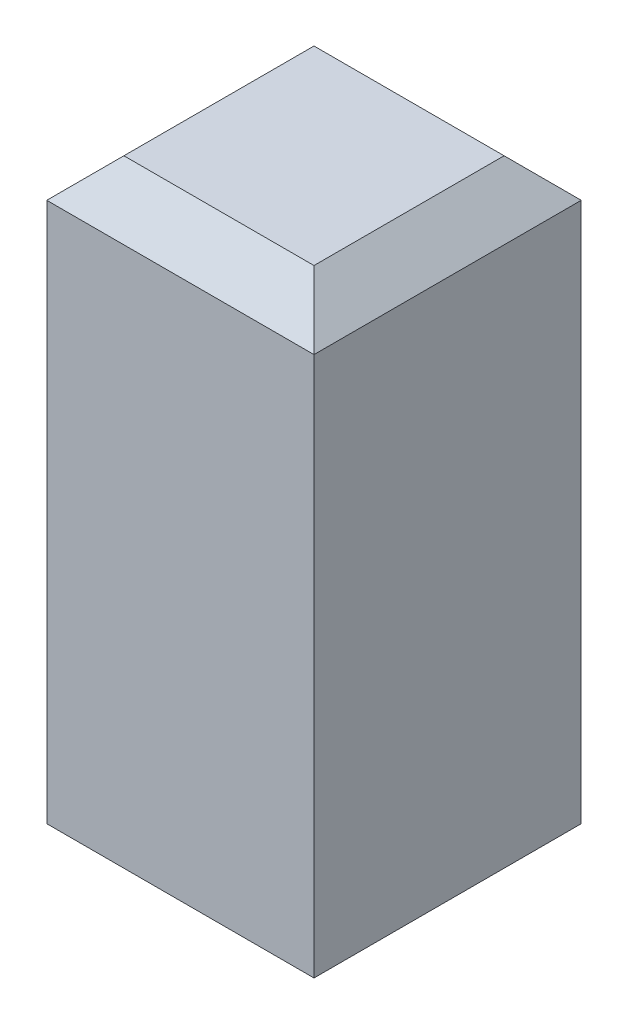
ISO-10303-21;
HEADER;
FILE_DESCRIPTION(('STEP AP214'),'2;1');
FILE_NAME('part.step','',(''),(''),'','','');
FILE_SCHEMA(('AUTOMOTIVE_DESIGN { 1 0 10303 214 1 1 1 1 }'));
ENDSEC;
DATA;
#1=APPLICATION_CONTEXT('core data for automotive mechanical design processes');
#2=APPLICATION_PROTOCOL_DEFINITION('international standard','automotive_design',2000,#1);
#3=PRODUCT_CONTEXT('',#1,'mechanical');
#4=PRODUCT('Part','Part','',(#3));
#5=PRODUCT_RELATED_PRODUCT_CATEGORY('part','',(#4));
#6=PRODUCT_DEFINITION_FORMATION('','',#4);
#7=PRODUCT_DEFINITION_CONTEXT('part definition',#1,'design');
#8=PRODUCT_DEFINITION('design','',#6,#7);
#9=PRODUCT_DEFINITION_SHAPE('','',#8);
#10=(LENGTH_UNIT() NAMED_UNIT(*) SI_UNIT(.MILLI.,.METRE.));
#11=(NAMED_UNIT(*) PLANE_ANGLE_UNIT() SI_UNIT($,.RADIAN.));
#12=(NAMED_UNIT(*) SI_UNIT($,.STERADIAN.) SOLID_ANGLE_UNIT());
#13=UNCERTAINTY_MEASURE_WITH_UNIT(LENGTH_MEASURE(1.E-05),#10,'distance_accuracy_value','');
#14=(GEOMETRIC_REPRESENTATION_CONTEXT(3) GLOBAL_UNCERTAINTY_ASSIGNED_CONTEXT((#13)) GLOBAL_UNIT_ASSIGNED_CONTEXT((#10,
#11,#12)) REPRESENTATION_CONTEXT('',''));
#15=CARTESIAN_POINT('',(0.,0.,0.));
#16=DIRECTION('',(0.,0.,1.));
#17=DIRECTION('',(1.,0.,0.));
#18=AXIS2_PLACEMENT_3D('',#15,#16,#17);
#19=CARTESIAN_POINT('',(0.,10.16,0.));
#20=DIRECTION('',(1.,0.,0.));
#21=DIRECTION('',(0.,0.,-1.));
#22=AXIS2_PLACEMENT_3D('',#19,#20,#21);
#23=PLANE('',#22);
#24=DIRECTION('',(0.,-1.,0.));
#25=VECTOR('',#24,1.);
#26=CARTESIAN_POINT('',(0.,10.16,-4.40032549932388));
#27=LINE('',#26,#25);
#28=CARTESIAN_POINT('',(0.,9.525,-4.40032549932388));
#29=VERTEX_POINT('',#28);
#30=CARTESIAN_POINT('',(0.,0.635,-4.40032549932388));
#31=VERTEX_POINT('',#30);
#32=EDGE_CURVE('E151',#29,#31,#27,.T.);
#33=ORIENTED_EDGE('',*,*,#32,.T.);
#34=DIRECTION('',(0.,0.,1.));
#35=VECTOR('',#34,1.);
#36=CARTESIAN_POINT('',(0.,0.635,0.));
#37=LINE('',#36,#35);
#38=CARTESIAN_POINT('',(0.,0.635,0.));
#39=VERTEX_POINT('',#38);
#40=EDGE_CURVE('E160',#31,#39,#37,.T.);
#41=ORIENTED_EDGE('',*,*,#40,.T.);
#42=DIRECTION('',(0.,-1.,0.));
#43=VECTOR('',#42,1.);
#44=CARTESIAN_POINT('',(0.,10.16,0.));
#45=LINE('',#44,#43);
#46=CARTESIAN_POINT('',(0.,9.525,0.));
#47=VERTEX_POINT('',#46);
#48=EDGE_CURVE('E129',#47,#39,#45,.T.);
#49=ORIENTED_EDGE('',*,*,#48,.F.);
#50=DIRECTION('',(0.,0.,-1.));
#51=VECTOR('',#50,1.);
#52=CARTESIAN_POINT('',(0.,9.525,0.));
#53=LINE('',#52,#51);
#54=EDGE_CURVE('E162',#47,#29,#53,.T.);
#55=ORIENTED_EDGE('',*,*,#54,.T.);
#56=EDGE_LOOP('',(#33,#41,#49,#55));
#57=FACE_BOUND('',#56,.T.);
#58=ADVANCED_FACE('F41',(#57),#23,.F.);
#59=CARTESIAN_POINT('',(0.,10.16,0.));
#60=DIRECTION('',(0.,0.,-1.));
#61=DIRECTION('',(-1.,0.,0.));
#62=AXIS2_PLACEMENT_3D('',#59,#60,#61);
#63=PLANE('',#62);
#64=ORIENTED_EDGE('',*,*,#48,.T.);
#65=DIRECTION('',(1.,0.,0.));
#66=VECTOR('',#65,1.);
#67=CARTESIAN_POINT('',(4.40032549932388,0.635,0.));
#68=LINE('',#67,#66);
#69=CARTESIAN_POINT('',(4.40032549932388,0.635,0.));
#70=VERTEX_POINT('',#69);
#71=EDGE_CURVE('E128',#39,#70,#68,.T.);
#72=ORIENTED_EDGE('',*,*,#71,.T.);
#73=DIRECTION('',(0.,-1.,0.));
#74=VECTOR('',#73,1.);
#75=CARTESIAN_POINT('',(4.40032549932388,10.16,0.));
#76=LINE('',#75,#74);
#77=CARTESIAN_POINT('',(4.40032549932388,9.525,0.));
#78=VERTEX_POINT('',#77);
#79=EDGE_CURVE('E111',#78,#70,#76,.T.);
#80=ORIENTED_EDGE('',*,*,#79,.F.);
#81=DIRECTION('',(-1.,0.,0.));
#82=VECTOR('',#81,1.);
#83=CARTESIAN_POINT('',(0.,9.525,0.));
#84=LINE('',#83,#82);
#85=EDGE_CURVE('E125',#78,#47,#84,.T.);
#86=ORIENTED_EDGE('',*,*,#85,.T.);
#87=EDGE_LOOP('',(#64,#72,#80,#86));
#88=FACE_BOUND('',#87,.T.);
#89=ADVANCED_FACE('F124',(#88),#63,.F.);
#90=CARTESIAN_POINT('',(4.40032549932388,10.16,0.));
#91=DIRECTION('',(-1.,0.,0.));
#92=DIRECTION('',(0.,0.,1.));
#93=AXIS2_PLACEMENT_3D('',#90,#91,#92);
#94=PLANE('',#93);
#95=ORIENTED_EDGE('',*,*,#79,.T.);
#96=DIRECTION('',(0.,0.,-1.));
#97=VECTOR('',#96,1.);
#98=CARTESIAN_POINT('',(4.40032549932388,0.635,-4.40032549932388));
#99=LINE('',#98,#97);
#100=CARTESIAN_POINT('',(4.40032549932388,0.635,-4.40032549932388));
#101=VERTEX_POINT('',#100);
#102=EDGE_CURVE('E117',#70,#101,#99,.T.);
#103=ORIENTED_EDGE('',*,*,#102,.T.);
#104=DIRECTION('',(0.,-1.,0.));
#105=VECTOR('',#104,1.);
#106=CARTESIAN_POINT('',(4.40032549932388,10.16,-4.40032549932388));
#107=LINE('',#106,#105);
#108=CARTESIAN_POINT('',(4.40032549932388,9.525,-4.40032549932388));
#109=VERTEX_POINT('',#108);
#110=EDGE_CURVE('E113',#109,#101,#107,.T.);
#111=ORIENTED_EDGE('',*,*,#110,.F.);
#112=DIRECTION('',(0.,0.,1.));
#113=VECTOR('',#112,1.);
#114=CARTESIAN_POINT('',(4.40032549932388,9.525,0.));
#115=LINE('',#114,#113);
#116=EDGE_CURVE('E108',#109,#78,#115,.T.);
#117=ORIENTED_EDGE('',*,*,#116,.T.);
#118=EDGE_LOOP('',(#95,#103,#111,#117));
#119=FACE_BOUND('',#118,.T.);
#120=ADVANCED_FACE('F110',(#119),#94,.F.);
#121=CARTESIAN_POINT('',(0.,10.16,-4.40032549932388));
#122=DIRECTION('',(0.,0.,1.));
#123=DIRECTION('',(1.,0.,0.));
#124=AXIS2_PLACEMENT_3D('',#121,#122,#123);
#125=PLANE('',#124);
#126=ORIENTED_EDGE('',*,*,#110,.T.);
#127=DIRECTION('',(-1.,0.,0.));
#128=VECTOR('',#127,1.);
#129=CARTESIAN_POINT('',(0.,0.635,-4.40032549932388));
#130=LINE('',#129,#128);
#131=EDGE_CURVE('E164',#101,#31,#130,.T.);
#132=ORIENTED_EDGE('',*,*,#131,.T.);
#133=ORIENTED_EDGE('',*,*,#32,.F.);
#134=DIRECTION('',(1.,0.,0.));
#135=VECTOR('',#134,1.);
#136=CARTESIAN_POINT('',(0.,9.525,-4.40032549932388));
#137=LINE('',#136,#135);
#138=EDGE_CURVE('E166',#29,#109,#137,.T.);
#139=ORIENTED_EDGE('',*,*,#138,.T.);
#140=EDGE_LOOP('',(#126,#132,#133,#139));
#141=FACE_BOUND('',#140,.T.);
#142=ADVANCED_FACE('F204',(#141),#125,.F.);
#143=CARTESIAN_POINT('',(0.,10.16,0.));
#144=DIRECTION('',(0.,-1.,0.));
#145=DIRECTION('',(0.,0.,-1.));
#146=AXIS2_PLACEMENT_3D('',#143,#144,#145);
#147=PLANE('',#146);
#148=DIRECTION('',(0.,0.,-1.));
#149=VECTOR('',#148,1.);
#150=CARTESIAN_POINT('',(3.76532549932388,10.16,0.));
#151=LINE('',#150,#149);
#152=CARTESIAN_POINT('',(3.76532549932388,10.16,-0.635));
#153=VERTEX_POINT('',#152);
#154=CARTESIAN_POINT('',(3.76532549932388,10.16,-3.76532549932388));
#155=VERTEX_POINT('',#154);
#156=EDGE_CURVE('E51',#153,#155,#151,.T.);
#157=ORIENTED_EDGE('',*,*,#156,.T.);
#158=DIRECTION('',(-1.,0.,0.));
#159=VECTOR('',#158,1.);
#160=CARTESIAN_POINT('',(0.,10.16,-3.76532549932388));
#161=LINE('',#160,#159);
#162=CARTESIAN_POINT('',(0.635,10.16,-3.76532549932388));
#163=VERTEX_POINT('',#162);
#164=EDGE_CURVE('E11',#155,#163,#161,.T.);
#165=ORIENTED_EDGE('',*,*,#164,.T.);
#166=DIRECTION('',(0.,0.,1.));
#167=VECTOR('',#166,1.);
#168=CARTESIAN_POINT('',(0.635,10.16,0.));
#169=LINE('',#168,#167);
#170=CARTESIAN_POINT('',(0.635,10.16,-0.635));
#171=VERTEX_POINT('',#170);
#172=EDGE_CURVE('E158',#163,#171,#169,.T.);
#173=ORIENTED_EDGE('',*,*,#172,.T.);
#174=DIRECTION('',(1.,0.,0.));
#175=VECTOR('',#174,1.);
#176=CARTESIAN_POINT('',(0.,10.16,-0.635));
#177=LINE('',#176,#175);
#178=EDGE_CURVE('E62',#171,#153,#177,.T.);
#179=ORIENTED_EDGE('',*,*,#178,.T.);
#180=EDGE_LOOP('',(#157,#165,#173,#179));
#181=FACE_BOUND('',#180,.T.);
#182=ADVANCED_FACE('F210',(#181),#147,.F.);
#183=CARTESIAN_POINT('',(0.,0.,0.));
#184=DIRECTION('',(0.,-1.,0.));
#185=DIRECTION('',(0.,0.,-1.));
#186=AXIS2_PLACEMENT_3D('',#183,#184,#185);
#187=PLANE('',#186);
#188=DIRECTION('',(0.,0.,1.));
#189=VECTOR('',#188,1.);
#190=CARTESIAN_POINT('',(3.76532549932388,0.,0.));
#191=LINE('',#190,#189);
#192=CARTESIAN_POINT('',(3.76532549932388,0.,-3.76532549932388));
#193=VERTEX_POINT('',#192);
#194=CARTESIAN_POINT('',(3.76532549932388,0.,-0.635000000000002));
#195=VERTEX_POINT('',#194);
#196=EDGE_CURVE('E171',#193,#195,#191,.T.);
#197=ORIENTED_EDGE('',*,*,#196,.T.);
#198=DIRECTION('',(-1.,0.,0.));
#199=VECTOR('',#198,1.);
#200=CARTESIAN_POINT('',(0.,0.,-0.635000000000002));
#201=LINE('',#200,#199);
#202=CARTESIAN_POINT('',(0.635000000000002,0.,-0.635000000000002));
#203=VERTEX_POINT('',#202);
#204=EDGE_CURVE('E118',#195,#203,#201,.T.);
#205=ORIENTED_EDGE('',*,*,#204,.T.);
#206=DIRECTION('',(0.,0.,-1.));
#207=VECTOR('',#206,1.);
#208=CARTESIAN_POINT('',(0.635000000000002,0.,-4.40032549932388));
#209=LINE('',#208,#207);
#210=CARTESIAN_POINT('',(0.635000000000002,0.,-3.76532549932388));
#211=VERTEX_POINT('',#210);
#212=EDGE_CURVE('E175',#203,#211,#209,.T.);
#213=ORIENTED_EDGE('',*,*,#212,.T.);
#214=DIRECTION('',(1.,0.,0.));
#215=VECTOR('',#214,1.);
#216=CARTESIAN_POINT('',(4.40032549932388,0.,-3.76532549932388));
#217=LINE('',#216,#215);
#218=EDGE_CURVE('E173',#211,#193,#217,.T.);
#219=ORIENTED_EDGE('',*,*,#218,.T.);
#220=EDGE_LOOP('',(#197,#205,#213,#219));
#221=FACE_BOUND('',#220,.T.);
#222=ADVANCED_FACE('F212',(#221),#187,.T.);
#223=CARTESIAN_POINT('',(0.,0.635,-4.40032549932388));
#224=DIRECTION('',(0.,-0.707106781186548,-0.707106781186547));
#225=DIRECTION('',(1.,0.,0.));
#226=AXIS2_PLACEMENT_3D('',#223,#224,#225);
#227=PLANE('',#226);
#228=DIRECTION('',(-0.577350269189626,-0.577350269189625,0.577350269189626));
#229=VECTOR('',#228,1.);
#230=CARTESIAN_POINT('',(2.93355033288259,-0.831775166441294,-2.93355033288259));
#231=LINE('',#230,#229);
#232=EDGE_CURVE('E152',#193,#101,#231,.F.);
#233=ORIENTED_EDGE('',*,*,#232,.F.);
#234=ORIENTED_EDGE('',*,*,#218,.F.);
#235=DIRECTION('',(0.577350269189626,-0.577350269189625,0.577350269189626));
#236=VECTOR('',#235,1.);
#237=CARTESIAN_POINT('',(1.4667751664413,-0.831775166441294,-2.93355033288259));
#238=LINE('',#237,#236);
#239=EDGE_CURVE('E148',#31,#211,#238,.T.);
#240=ORIENTED_EDGE('',*,*,#239,.F.);
#241=ORIENTED_EDGE('',*,*,#131,.F.);
#242=EDGE_LOOP('',(#233,#234,#240,#241));
#243=FACE_BOUND('',#242,.T.);
#244=ADVANCED_FACE('F191',(#243),#227,.T.);
#245=CARTESIAN_POINT('',(0.,0.635,0.));
#246=DIRECTION('',(-0.707106781186547,-0.707106781186548,0.));
#247=DIRECTION('',(0.,0.,-1.));
#248=AXIS2_PLACEMENT_3D('',#245,#246,#247);
#249=PLANE('',#248);
#250=ORIENTED_EDGE('',*,*,#239,.T.);
#251=ORIENTED_EDGE('',*,*,#212,.F.);
#252=DIRECTION('',(-0.577350269189626,0.577350269189625,0.577350269189626));
#253=VECTOR('',#252,1.);
#254=CARTESIAN_POINT('',(0.,0.635,0.));
#255=LINE('',#254,#253);
#256=EDGE_CURVE('E139',#39,#203,#255,.F.);
#257=ORIENTED_EDGE('',*,*,#256,.F.);
#258=ORIENTED_EDGE('',*,*,#40,.F.);
#259=EDGE_LOOP('',(#250,#251,#257,#258));
#260=FACE_BOUND('',#259,.T.);
#261=ADVANCED_FACE('F195',(#260),#249,.T.);
#262=CARTESIAN_POINT('',(4.40032549932388,0.635,0.));
#263=DIRECTION('',(0.707106781186547,-0.707106781186548,0.));
#264=DIRECTION('',(0.,0.,1.));
#265=AXIS2_PLACEMENT_3D('',#262,#263,#264);
#266=PLANE('',#265);
#267=ORIENTED_EDGE('',*,*,#232,.T.);
#268=ORIENTED_EDGE('',*,*,#102,.F.);
#269=DIRECTION('',(-0.577350269189626,-0.577350269189625,-0.577350269189626));
#270=VECTOR('',#269,1.);
#271=CARTESIAN_POINT('',(4.40032549932388,0.635,0.));
#272=LINE('',#271,#270);
#273=EDGE_CURVE('E138',#195,#70,#272,.F.);
#274=ORIENTED_EDGE('',*,*,#273,.F.);
#275=ORIENTED_EDGE('',*,*,#196,.F.);
#276=EDGE_LOOP('',(#267,#268,#274,#275));
#277=FACE_BOUND('',#276,.T.);
#278=ADVANCED_FACE('F203',(#277),#266,.T.);
#279=CARTESIAN_POINT('',(0.,0.635,0.));
#280=DIRECTION('',(0.,-0.707106781186548,0.707106781186547));
#281=DIRECTION('',(-1.,0.,0.));
#282=AXIS2_PLACEMENT_3D('',#279,#280,#281);
#283=PLANE('',#282);
#284=ORIENTED_EDGE('',*,*,#256,.T.);
#285=ORIENTED_EDGE('',*,*,#204,.F.);
#286=ORIENTED_EDGE('',*,*,#273,.T.);
#287=ORIENTED_EDGE('',*,*,#71,.F.);
#288=EDGE_LOOP('',(#284,#285,#286,#287));
#289=FACE_BOUND('',#288,.T.);
#290=ADVANCED_FACE('F198',(#289),#283,.T.);
#291=CARTESIAN_POINT('',(0.,10.16,-0.635));
#292=DIRECTION('',(0.,-0.707106781186547,-0.707106781186548));
#293=DIRECTION('',(1.,0.,0.));
#294=AXIS2_PLACEMENT_3D('',#291,#292,#293);
#295=PLANE('',#294);
#296=DIRECTION('',(0.577350269189625,0.577350269189627,-0.577350269189625));
#297=VECTOR('',#296,1.);
#298=CARTESIAN_POINT('',(0.423333333333334,9.94833333333333,-0.423333333333334));
#299=LINE('',#298,#297);
#300=EDGE_CURVE('E134',#47,#171,#299,.T.);
#301=ORIENTED_EDGE('',*,*,#300,.F.);
#302=ORIENTED_EDGE('',*,*,#85,.F.);
#303=DIRECTION('',(-0.577350269189625,0.577350269189627,-0.577350269189625));
#304=VECTOR('',#303,1.);
#305=CARTESIAN_POINT('',(2.51021699954926,11.4151084997746,-1.89010849977463));
#306=LINE('',#305,#304);
#307=EDGE_CURVE('E46',#153,#78,#306,.F.);
#308=ORIENTED_EDGE('',*,*,#307,.F.);
#309=ORIENTED_EDGE('',*,*,#178,.F.);
#310=EDGE_LOOP('',(#301,#302,#308,#309));
#311=FACE_BOUND('',#310,.T.);
#312=ADVANCED_FACE('F44',(#311),#295,.F.);
#313=CARTESIAN_POINT('',(3.76532549932388,10.16,0.));
#314=DIRECTION('',(-0.707106781186548,-0.707106781186547,0.));
#315=DIRECTION('',(0.,0.,-1.));
#316=AXIS2_PLACEMENT_3D('',#313,#314,#315);
#317=PLANE('',#316);
#318=ORIENTED_EDGE('',*,*,#307,.T.);
#319=ORIENTED_EDGE('',*,*,#116,.F.);
#320=DIRECTION('',(-0.577350269189625,0.577350269189627,0.577350269189625));
#321=VECTOR('',#320,1.);
#322=CARTESIAN_POINT('',(2.51021699954926,11.4151084997746,-2.51021699954926));
#323=LINE('',#322,#321);
#324=EDGE_CURVE('E141',#155,#109,#323,.F.);
#325=ORIENTED_EDGE('',*,*,#324,.F.);
#326=ORIENTED_EDGE('',*,*,#156,.F.);
#327=EDGE_LOOP('',(#318,#319,#325,#326));
#328=FACE_BOUND('',#327,.T.);
#329=ADVANCED_FACE('F137',(#328),#317,.F.);
#330=CARTESIAN_POINT('',(0.635,10.16,0.));
#331=DIRECTION('',(0.707106781186548,-0.707106781186547,0.));
#332=DIRECTION('',(0.,0.,1.));
#333=AXIS2_PLACEMENT_3D('',#330,#331,#332);
#334=PLANE('',#333);
#335=ORIENTED_EDGE('',*,*,#300,.T.);
#336=ORIENTED_EDGE('',*,*,#172,.F.);
#337=DIRECTION('',(-0.577350269189625,-0.577350269189627,-0.577350269189625));
#338=VECTOR('',#337,1.);
#339=CARTESIAN_POINT('',(1.89010849977463,11.4151084997746,-2.51021699954926));
#340=LINE('',#339,#338);
#341=EDGE_CURVE('E144',#29,#163,#340,.F.);
#342=ORIENTED_EDGE('',*,*,#341,.F.);
#343=ORIENTED_EDGE('',*,*,#54,.F.);
#344=EDGE_LOOP('',(#335,#336,#342,#343));
#345=FACE_BOUND('',#344,.T.);
#346=ADVANCED_FACE('F209',(#345),#334,.F.);
#347=CARTESIAN_POINT('',(0.,10.16,-3.76532549932388));
#348=DIRECTION('',(0.,-0.707106781186547,0.707106781186548));
#349=DIRECTION('',(-1.,0.,0.));
#350=AXIS2_PLACEMENT_3D('',#347,#348,#349);
#351=PLANE('',#350);
#352=ORIENTED_EDGE('',*,*,#324,.T.);
#353=ORIENTED_EDGE('',*,*,#138,.F.);
#354=ORIENTED_EDGE('',*,*,#341,.T.);
#355=ORIENTED_EDGE('',*,*,#164,.F.);
#356=EDGE_LOOP('',(#352,#353,#354,#355));
#357=FACE_BOUND('',#356,.T.);
#358=ADVANCED_FACE('F207',(#357),#351,.F.);
#359=CLOSED_SHELL('',(#58,#89,#120,#142,#182,#222,#244,#261,#278,#290,#312,#329,#346,#358));
#360=MANIFOLD_SOLID_BREP('B2',#359);
#361=ADVANCED_BREP_SHAPE_REPRESENTATION('',(#18,#360),#14);
#362=SHAPE_DEFINITION_REPRESENTATION(#9,#361);
ENDSEC;
END-ISO-10303-21;
